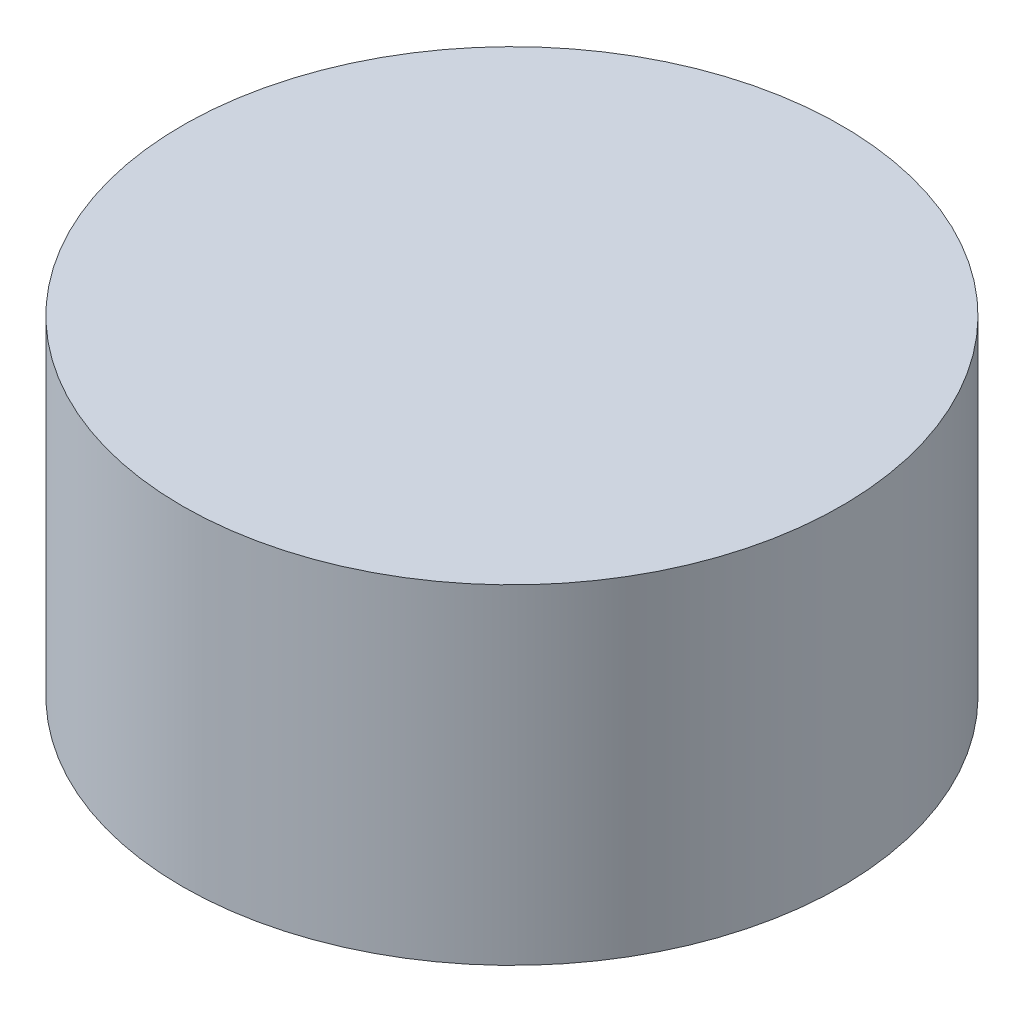
ISO-10303-21;
HEADER;
FILE_DESCRIPTION(('STEP AP214'),'2;1');
FILE_NAME('part.step','',(''),(''),'','','');
FILE_SCHEMA(('AUTOMOTIVE_DESIGN { 1 0 10303 214 1 1 1 1 }'));
ENDSEC;
DATA;
#1=APPLICATION_CONTEXT('core data for automotive mechanical design processes');
#2=APPLICATION_PROTOCOL_DEFINITION('international standard','automotive_design',2000,#1);
#3=PRODUCT_CONTEXT('',#1,'mechanical');
#4=PRODUCT('Part','Part','',(#3));
#5=PRODUCT_RELATED_PRODUCT_CATEGORY('part','',(#4));
#6=PRODUCT_DEFINITION_FORMATION('','',#4);
#7=PRODUCT_DEFINITION_CONTEXT('part definition',#1,'design');
#8=PRODUCT_DEFINITION('design','',#6,#7);
#9=PRODUCT_DEFINITION_SHAPE('','',#8);
#10=(LENGTH_UNIT() NAMED_UNIT(*) SI_UNIT(.MILLI.,.METRE.));
#11=(NAMED_UNIT(*) PLANE_ANGLE_UNIT() SI_UNIT($,.RADIAN.));
#12=(NAMED_UNIT(*) SI_UNIT($,.STERADIAN.) SOLID_ANGLE_UNIT());
#13=UNCERTAINTY_MEASURE_WITH_UNIT(LENGTH_MEASURE(1.E-05),#10,'distance_accuracy_value','');
#14=(GEOMETRIC_REPRESENTATION_CONTEXT(3) GLOBAL_UNCERTAINTY_ASSIGNED_CONTEXT((#13)) GLOBAL_UNIT_ASSIGNED_CONTEXT((#10,
#11,#12)) REPRESENTATION_CONTEXT('',''));
#15=CARTESIAN_POINT('',(0.,0.,0.));
#16=DIRECTION('',(0.,0.,1.));
#17=DIRECTION('',(1.,0.,0.));
#18=AXIS2_PLACEMENT_3D('',#15,#16,#17);
#19=CARTESIAN_POINT('',(0.,30.,0.));
#20=DIRECTION('',(0.,-1.,0.));
#21=DIRECTION('',(0.,0.,-1.));
#22=AXIS2_PLACEMENT_3D('',#19,#20,#21);
#23=CYLINDRICAL_SURFACE('',#22,12.);
#24=CARTESIAN_POINT('',(0.,30.,0.));
#25=DIRECTION('',(0.,1.,0.));
#26=DIRECTION('',(0.,0.,1.));
#27=AXIS2_PLACEMENT_3D('',#24,#25,#26);
#28=CIRCLE('',#27,12.);
#29=CARTESIAN_POINT('',(0.,30.,12.));
#30=VERTEX_POINT('',#29);
#31=EDGE_CURVE('E10',#30,#30,#28,.T.);
#32=ORIENTED_EDGE('',*,*,#31,.F.);
#33=EDGE_LOOP('',(#32));
#34=FACE_BOUND('',#33,.T.);
#35=CARTESIAN_POINT('',(0.,18.,0.));
#36=DIRECTION('',(0.,1.,0.));
#37=DIRECTION('',(0.,0.,1.));
#38=AXIS2_PLACEMENT_3D('',#35,#36,#37);
#39=CIRCLE('',#38,12.);
#40=CARTESIAN_POINT('',(0.,18.,12.));
#41=VERTEX_POINT('',#40);
#42=EDGE_CURVE('E40',#41,#41,#39,.T.);
#43=ORIENTED_EDGE('',*,*,#42,.T.);
#44=EDGE_LOOP('',(#43));
#45=FACE_BOUND('',#44,.T.);
#46=ADVANCED_FACE('F37',(#34,#45),#23,.T.);
#47=CARTESIAN_POINT('',(0.,30.,0.));
#48=DIRECTION('',(0.,1.,0.));
#49=DIRECTION('',(0.,0.,1.));
#50=AXIS2_PLACEMENT_3D('',#47,#48,#49);
#51=PLANE('',#50);
#52=ORIENTED_EDGE('',*,*,#31,.T.);
#53=EDGE_LOOP('',(#52));
#54=FACE_BOUND('',#53,.T.);
#55=ADVANCED_FACE('F52',(#54),#51,.T.);
#56=CARTESIAN_POINT('',(0.,18.,0.));
#57=DIRECTION('',(0.,1.,0.));
#58=DIRECTION('',(0.,0.,1.));
#59=AXIS2_PLACEMENT_3D('',#56,#57,#58);
#60=PLANE('',#59);
#61=ORIENTED_EDGE('',*,*,#42,.F.);
#62=EDGE_LOOP('',(#61));
#63=FACE_BOUND('',#62,.T.);
#64=ADVANCED_FACE('F50',(#63),#60,.F.);
#65=CLOSED_SHELL('',(#46,#55,#64));
#66=MANIFOLD_SOLID_BREP('B2',#65);
#67=ADVANCED_BREP_SHAPE_REPRESENTATION('',(#18,#66),#14);
#68=SHAPE_DEFINITION_REPRESENTATION(#9,#67);
ENDSEC;
END-ISO-10303-21;
